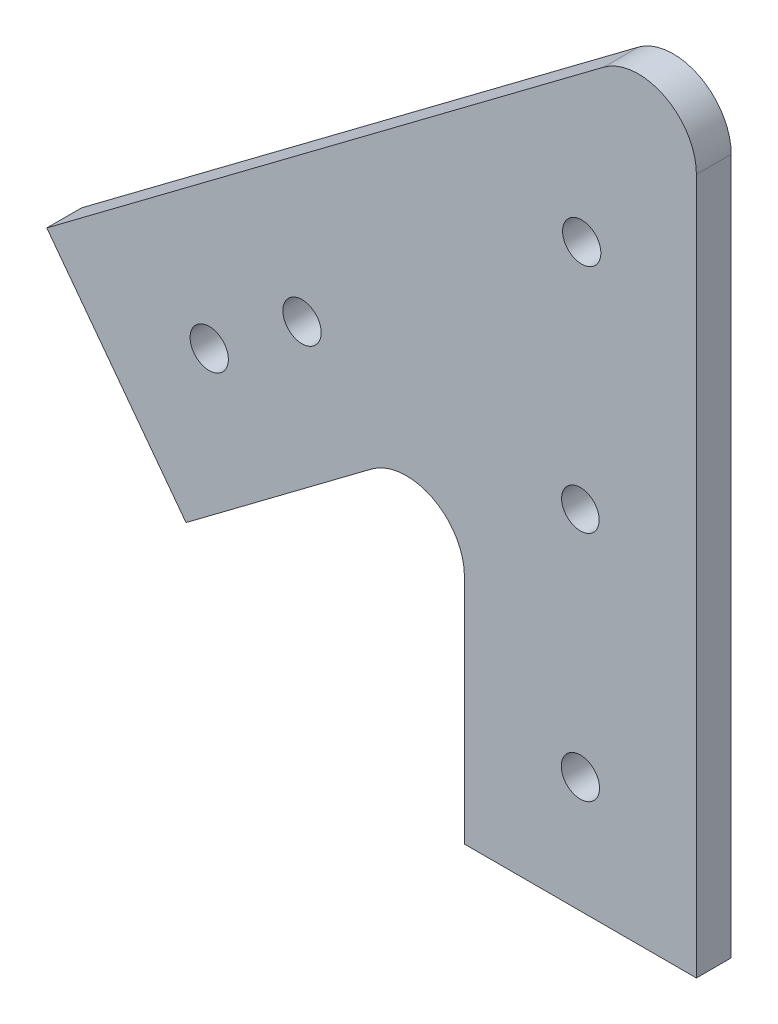
ISO-10303-21;
HEADER;
FILE_DESCRIPTION(('STEP AP214'),'2;1');
FILE_NAME('part.step','',(''),(''),'','','');
FILE_SCHEMA(('AUTOMOTIVE_DESIGN { 1 0 10303 214 1 1 1 1 }'));
ENDSEC;
DATA;
#1=APPLICATION_CONTEXT('core data for automotive mechanical design processes');
#2=APPLICATION_PROTOCOL_DEFINITION('international standard','automotive_design',2000,#1);
#3=PRODUCT_CONTEXT('',#1,'mechanical');
#4=PRODUCT('Part','Part','',(#3));
#5=PRODUCT_RELATED_PRODUCT_CATEGORY('part','',(#4));
#6=PRODUCT_DEFINITION_FORMATION('','',#4);
#7=PRODUCT_DEFINITION_CONTEXT('part definition',#1,'design');
#8=PRODUCT_DEFINITION('design','',#6,#7);
#9=PRODUCT_DEFINITION_SHAPE('','',#8);
#10=(LENGTH_UNIT() NAMED_UNIT(*) SI_UNIT(.MILLI.,.METRE.));
#11=(NAMED_UNIT(*) PLANE_ANGLE_UNIT() SI_UNIT($,.RADIAN.));
#12=(NAMED_UNIT(*) SI_UNIT($,.STERADIAN.) SOLID_ANGLE_UNIT());
#13=UNCERTAINTY_MEASURE_WITH_UNIT(LENGTH_MEASURE(1.E-05),#10,'distance_accuracy_value','');
#14=(GEOMETRIC_REPRESENTATION_CONTEXT(3) GLOBAL_UNCERTAINTY_ASSIGNED_CONTEXT((#13)) GLOBAL_UNIT_ASSIGNED_CONTEXT((#10,
#11,#12)) REPRESENTATION_CONTEXT('',''));
#15=CARTESIAN_POINT('',(0.,0.,0.));
#16=DIRECTION('',(0.,0.,1.));
#17=DIRECTION('',(1.,0.,0.));
#18=AXIS2_PLACEMENT_3D('',#15,#16,#17);
#19=CARTESIAN_POINT('',(-6.68660671893292,8.91547372518952,3.));
#20=DIRECTION('',(-0.60000008183758,0.799999938621808,0.));
#21=DIRECTION('',(-0.799999938621809,-0.60000008183758,0.));
#22=AXIS2_PLACEMENT_3D('',#19,#20,#21);
#23=PLANE('',#22);
#24=DIRECTION('',(0.799999938621809,0.60000008183758,0.));
#25=VECTOR('',#24,1.);
#26=CARTESIAN_POINT('',(-6.68660671893292,8.91547372518952,3.));
#27=LINE('',#26,#25);
#28=CARTESIAN_POINT('',(-28.3858603790068,-7.35896998825369,3.));
#29=VERTEX_POINT('',#28);
#30=CARTESIAN_POINT('',(19.611272302062,28.6388871943635,3.));
#31=VERTEX_POINT('',#30);
#32=EDGE_CURVE('E111',#29,#31,#27,.T.);
#33=ORIENTED_EDGE('',*,*,#32,.T.);
#34=DIRECTION('',(0.,0.,-1.));
#35=VECTOR('',#34,1.);
#36=CARTESIAN_POINT('',(19.611272302062,28.6388871943635,0.));
#37=LINE('',#36,#35);
#38=CARTESIAN_POINT('',(19.611272302062,28.6388871943635,0.));
#39=VERTEX_POINT('',#38);
#40=EDGE_CURVE('E118',#31,#39,#37,.T.);
#41=ORIENTED_EDGE('',*,*,#40,.T.);
#42=DIRECTION('',(0.799999938621809,0.60000008183758,0.));
#43=VECTOR('',#42,1.);
#44=CARTESIAN_POINT('',(-6.68660671893292,8.91547372518952,0.));
#45=LINE('',#44,#43);
#46=CARTESIAN_POINT('',(-28.3858603790068,-7.35896998825369,0.));
#47=VERTEX_POINT('',#46);
#48=EDGE_CURVE('E114',#47,#39,#45,.T.);
#49=ORIENTED_EDGE('',*,*,#48,.F.);
#50=DIRECTION('',(0.,0.,-1.));
#51=VECTOR('',#50,1.);
#52=CARTESIAN_POINT('',(-28.3858603790068,-7.35896998825369,3.));
#53=LINE('',#52,#51);
#54=EDGE_CURVE('E107',#29,#47,#53,.T.);
#55=ORIENTED_EDGE('',*,*,#54,.F.);
#56=EDGE_LOOP('',(#33,#41,#49,#55));
#57=FACE_BOUND('',#56,.T.);
#58=ADVANCED_FACE('F43',(#57),#23,.T.);
#59=CARTESIAN_POINT('',(-21.6992536600739,-16.2744437134432,3.));
#60=DIRECTION('',(0.799999938621811,0.600000081837577,0.));
#61=DIRECTION('',(-0.600000081837577,0.799999938621811,0.));
#62=AXIS2_PLACEMENT_3D('',#59,#60,#61);
#63=PLANE('',#62);
#64=DIRECTION('',(0.600000081837577,-0.799999938621811,0.));
#65=VECTOR('',#64,1.);
#66=CARTESIAN_POINT('',(-21.6992536600739,-16.2744437134432,0.));
#67=LINE('',#66,#65);
#68=CARTESIAN_POINT('',(-16.3858587422554,-23.3589687606897,0.));
#69=VERTEX_POINT('',#68);
#70=EDGE_CURVE('E164',#47,#69,#67,.T.);
#71=ORIENTED_EDGE('',*,*,#70,.T.);
#72=DIRECTION('',(0.,0.,-1.));
#73=VECTOR('',#72,1.);
#74=CARTESIAN_POINT('',(-16.3858587422554,-23.3589687606897,3.));
#75=LINE('',#74,#73);
#76=CARTESIAN_POINT('',(-16.3858587422554,-23.3589687606897,3.));
#77=VERTEX_POINT('',#76);
#78=EDGE_CURVE('E119',#77,#69,#75,.T.);
#79=ORIENTED_EDGE('',*,*,#78,.F.);
#80=DIRECTION('',(0.600000081837577,-0.799999938621811,0.));
#81=VECTOR('',#80,1.);
#82=CARTESIAN_POINT('',(-21.6992536600739,-16.2744437134432,3.));
#83=LINE('',#82,#81);
#84=EDGE_CURVE('E123',#29,#77,#83,.T.);
#85=ORIENTED_EDGE('',*,*,#84,.F.);
#86=ORIENTED_EDGE('',*,*,#54,.T.);
#87=EDGE_LOOP('',(#71,#79,#85,#86));
#88=FACE_BOUND('',#87,.T.);
#89=ADVANCED_FACE('F124',(#88),#63,.F.);
#90=CARTESIAN_POINT('',(5.31339491781853,-7.08452504724652,3.));
#91=DIRECTION('',(-0.600000081837576,0.799999938621811,0.));
#92=DIRECTION('',(-0.799999938621812,-0.600000081837576,0.));
#93=AXIS2_PLACEMENT_3D('',#90,#91,#92);
#94=PLANE('',#93);
#95=DIRECTION('',(0.799999938621812,0.600000081837576,0.));
#96=VECTOR('',#95,1.);
#97=CARTESIAN_POINT('',(5.31339491781853,-7.08452504724652,0.));
#98=LINE('',#97,#96);
#99=CARTESIAN_POINT('',(-0.386944549546448,-11.359780558907,0.));
#100=VERTEX_POINT('',#99);
#101=EDGE_CURVE('E166',#69,#100,#98,.T.);
#102=ORIENTED_EDGE('',*,*,#101,.T.);
#103=DIRECTION('',(0.,0.,-1.));
#104=VECTOR('',#103,1.);
#105=CARTESIAN_POINT('',(-0.386944549546447,-11.359780558907,3.));
#106=LINE('',#105,#104);
#107=CARTESIAN_POINT('',(-0.386944549546448,-11.359780558907,3.));
#108=VERTEX_POINT('',#107);
#109=EDGE_CURVE('E64',#100,#108,#106,.F.);
#110=ORIENTED_EDGE('',*,*,#109,.T.);
#111=DIRECTION('',(0.799999938621812,0.600000081837576,0.));
#112=VECTOR('',#111,1.);
#113=CARTESIAN_POINT('',(5.31339491781853,-7.08452504724652,3.));
#114=LINE('',#113,#112);
#115=EDGE_CURVE('E126',#77,#108,#114,.T.);
#116=ORIENTED_EDGE('',*,*,#115,.F.);
#117=ORIENTED_EDGE('',*,*,#78,.T.);
#118=EDGE_LOOP('',(#102,#110,#116,#117));
#119=FACE_BOUND('',#118,.T.);
#120=ADVANCED_FACE('F198',(#119),#94,.F.);
#121=CARTESIAN_POINT('',(7.61471993844445,-0.000825008627086125,3.));
#122=DIRECTION('',(0.999999994130797,-0.000108343921892486,0.));
#123=DIRECTION('',(0.000108343921892486,0.999999994130797,0.));
#124=AXIS2_PLACEMENT_3D('',#121,#122,#123);
#125=PLANE('',#124);
#126=DIRECTION('',(-0.000108343921892486,-0.999999994130797,0.));
#127=VECTOR('',#126,1.);
#128=CARTESIAN_POINT('',(7.61471993844445,-0.000825008627086125,3.));
#129=LINE('',#128,#127);
#130=CARTESIAN_POINT('',(7.61305583029542,-15.3603219716255,3.));
#131=VERTEX_POINT('',#130);
#132=CARTESIAN_POINT('',(7.6108891709763,-35.3582994174868,3.));
#133=VERTEX_POINT('',#132);
#134=EDGE_CURVE('E140',#131,#133,#129,.T.);
#135=ORIENTED_EDGE('',*,*,#134,.F.);
#136=DIRECTION('',(0.,0.,-1.));
#137=VECTOR('',#136,1.);
#138=CARTESIAN_POINT('',(7.61305583029542,-15.3603219716255,0.));
#139=LINE('',#138,#137);
#140=CARTESIAN_POINT('',(7.61305583029542,-15.3603219716255,0.));
#141=VERTEX_POINT('',#140);
#142=EDGE_CURVE('E189',#131,#141,#139,.T.);
#143=ORIENTED_EDGE('',*,*,#142,.T.);
#144=DIRECTION('',(-0.000108343921892486,-0.999999994130797,0.));
#145=VECTOR('',#144,1.);
#146=CARTESIAN_POINT('',(7.61471993844445,-0.000825008627086125,0.));
#147=LINE('',#146,#145);
#148=CARTESIAN_POINT('',(7.6108891709763,-35.3582994174868,0.));
#149=VERTEX_POINT('',#148);
#150=EDGE_CURVE('E168',#141,#149,#147,.T.);
#151=ORIENTED_EDGE('',*,*,#150,.T.);
#152=DIRECTION('',(0.,0.,-1.));
#153=VECTOR('',#152,1.);
#154=CARTESIAN_POINT('',(7.6108891709763,-35.3582994174868,3.));
#155=LINE('',#154,#153);
#156=EDGE_CURVE('E179',#133,#149,#155,.T.);
#157=ORIENTED_EDGE('',*,*,#156,.F.);
#158=EDGE_LOOP('',(#135,#143,#151,#157));
#159=FACE_BOUND('',#158,.T.);
#160=ADVANCED_FACE('F200',(#159),#125,.F.);
#161=CARTESIAN_POINT('',(0.,-35.3582994174867,3.));
#162=DIRECTION('',(0.,1.,0.));
#163=DIRECTION('',(0.,0.,1.));
#164=AXIS2_PLACEMENT_3D('',#161,#162,#163);
#165=PLANE('',#164);
#166=DIRECTION('',(1.,0.,0.));
#167=VECTOR('',#166,1.);
#168=CARTESIAN_POINT('',(0.,-35.3582994174867,0.));
#169=LINE('',#168,#167);
#170=CARTESIAN_POINT('',(27.6108890921853,-35.3582994174867,0.));
#171=VERTEX_POINT('',#170);
#172=EDGE_CURVE('E170',#149,#171,#169,.T.);
#173=ORIENTED_EDGE('',*,*,#172,.T.);
#174=DIRECTION('',(0.,0.,-1.));
#175=VECTOR('',#174,1.);
#176=CARTESIAN_POINT('',(27.6108890921853,-35.3582994174867,3.));
#177=LINE('',#176,#175);
#178=CARTESIAN_POINT('',(27.6108890921853,-35.3582994174867,3.));
#179=VERTEX_POINT('',#178);
#180=EDGE_CURVE('E147',#179,#171,#177,.T.);
#181=ORIENTED_EDGE('',*,*,#180,.F.);
#182=DIRECTION('',(1.,0.,0.));
#183=VECTOR('',#182,1.);
#184=CARTESIAN_POINT('',(0.,-35.3582994174867,3.));
#185=LINE('',#184,#183);
#186=EDGE_CURVE('E142',#133,#179,#185,.T.);
#187=ORIENTED_EDGE('',*,*,#186,.F.);
#188=ORIENTED_EDGE('',*,*,#156,.T.);
#189=EDGE_LOOP('',(#173,#181,#187,#188));
#190=FACE_BOUND('',#189,.T.);
#191=ADVANCED_FACE('F205',(#190),#165,.F.);
#192=CARTESIAN_POINT('',(-14.3858601744131,-9.35896855609586,3.));
#193=DIRECTION('',(0.,0.,-1.));
#194=DIRECTION('',(-1.,0.,0.));
#195=AXIS2_PLACEMENT_3D('',#192,#193,#194);
#196=CYLINDRICAL_SURFACE('',#195,1.64999999999982);
#197=CARTESIAN_POINT('',(-14.3858601744131,-9.35896855609586,3.));
#198=DIRECTION('',(0.,0.,1.));
#199=DIRECTION('',(1.,0.,0.));
#200=AXIS2_PLACEMENT_3D('',#197,#198,#199);
#201=CIRCLE('',#200,1.64999999999982);
#202=CARTESIAN_POINT('',(-12.7358601744133,-9.35896855609586,3.));
#203=VERTEX_POINT('',#202);
#204=EDGE_CURVE('E132',#203,#203,#201,.T.);
#205=ORIENTED_EDGE('',*,*,#204,.T.);
#206=EDGE_LOOP('',(#205));
#207=FACE_BOUND('',#206,.T.);
#208=CARTESIAN_POINT('',(-14.3858601744131,-9.35896855609586,0.));
#209=DIRECTION('',(0.,0.,1.));
#210=DIRECTION('',(1.,0.,0.));
#211=AXIS2_PLACEMENT_3D('',#208,#209,#210);
#212=CIRCLE('',#211,1.64999999999982);
#213=CARTESIAN_POINT('',(-12.7358601744133,-9.35896855609586,0.));
#214=VERTEX_POINT('',#213);
#215=EDGE_CURVE('E160',#214,#214,#212,.T.);
#216=ORIENTED_EDGE('',*,*,#215,.F.);
#217=EDGE_LOOP('',(#216));
#218=FACE_BOUND('',#217,.T.);
#219=ADVANCED_FACE('F229',(#207,#218),#196,.F.);
#220=CARTESIAN_POINT('',(-6.38586078819503,-3.3589677377201,3.));
#221=DIRECTION('',(0.,0.,-1.));
#222=DIRECTION('',(-1.,0.,0.));
#223=AXIS2_PLACEMENT_3D('',#220,#221,#222);
#224=CYLINDRICAL_SURFACE('',#223,1.64999999999982);
#225=CARTESIAN_POINT('',(-6.38586078819503,-3.3589677377201,3.));
#226=DIRECTION('',(0.,0.,1.));
#227=DIRECTION('',(1.,0.,0.));
#228=AXIS2_PLACEMENT_3D('',#225,#226,#227);
#229=CIRCLE('',#228,1.64999999999982);
#230=CARTESIAN_POINT('',(-4.73586078819521,-3.3589677377201,3.));
#231=VERTEX_POINT('',#230);
#232=EDGE_CURVE('E135',#231,#231,#229,.T.);
#233=ORIENTED_EDGE('',*,*,#232,.T.);
#234=EDGE_LOOP('',(#233));
#235=FACE_BOUND('',#234,.T.);
#236=CARTESIAN_POINT('',(-6.38586078819503,-3.3589677377201,0.));
#237=DIRECTION('',(0.,0.,1.));
#238=DIRECTION('',(1.,0.,0.));
#239=AXIS2_PLACEMENT_3D('',#236,#237,#238);
#240=CIRCLE('',#239,1.64999999999982);
#241=CARTESIAN_POINT('',(-4.73586078819521,-3.3589677377201,0.));
#242=VERTEX_POINT('',#241);
#243=EDGE_CURVE('E157',#242,#242,#240,.T.);
#244=ORIENTED_EDGE('',*,*,#243,.F.);
#245=EDGE_LOOP('',(#244));
#246=FACE_BOUND('',#245,.T.);
#247=ADVANCED_FACE('F232',(#235,#246),#224,.F.);
#248=CARTESIAN_POINT('',(17.6109530315067,-25.3582994174867,3.));
#249=DIRECTION('',(0.,0.,-1.));
#250=DIRECTION('',(-1.,0.,0.));
#251=AXIS2_PLACEMENT_3D('',#248,#249,#250);
#252=CYLINDRICAL_SURFACE('',#251,1.64999999999959);
#253=CARTESIAN_POINT('',(17.6109530315067,-25.3582994174867,3.));
#254=DIRECTION('',(0.,0.,1.));
#255=DIRECTION('',(1.,0.,0.));
#256=AXIS2_PLACEMENT_3D('',#253,#254,#255);
#257=CIRCLE('',#256,1.64999999999959);
#258=CARTESIAN_POINT('',(19.2609530315063,-25.3582994174867,3.));
#259=VERTEX_POINT('',#258);
#260=EDGE_CURVE('E270',#259,#259,#257,.T.);
#261=ORIENTED_EDGE('',*,*,#260,.T.);
#262=EDGE_LOOP('',(#261));
#263=FACE_BOUND('',#262,.T.);
#264=CARTESIAN_POINT('',(17.6109530315067,-25.3582994174867,0.));
#265=DIRECTION('',(0.,0.,1.));
#266=DIRECTION('',(1.,0.,0.));
#267=AXIS2_PLACEMENT_3D('',#264,#265,#266);
#268=CIRCLE('',#267,1.64999999999959);
#269=CARTESIAN_POINT('',(19.2609530315063,-25.3582994174867,0.));
#270=VERTEX_POINT('',#269);
#271=EDGE_CURVE('E154',#270,#270,#268,.T.);
#272=ORIENTED_EDGE('',*,*,#271,.F.);
#273=EDGE_LOOP('',(#272));
#274=FACE_BOUND('',#273,.T.);
#275=ADVANCED_FACE('F236',(#263,#274),#252,.F.);
#276=CARTESIAN_POINT('',(17.6109530315061,-5.35829941748672,3.));
#277=DIRECTION('',(0.,0.,-1.));
#278=DIRECTION('',(-1.,0.,0.));
#279=AXIS2_PLACEMENT_3D('',#276,#277,#278);
#280=CYLINDRICAL_SURFACE('',#279,1.62029537425608);
#281=CARTESIAN_POINT('',(17.6109530315061,-5.35829941748672,3.));
#282=DIRECTION('',(0.,0.,1.));
#283=DIRECTION('',(1.,0.,0.));
#284=AXIS2_PLACEMENT_3D('',#281,#282,#283);
#285=CIRCLE('',#284,1.62029537425608);
#286=CARTESIAN_POINT('',(19.2312484057621,-5.35829941748672,3.));
#287=VERTEX_POINT('',#286);
#288=EDGE_CURVE('E267',#287,#287,#285,.T.);
#289=ORIENTED_EDGE('',*,*,#288,.T.);
#290=EDGE_LOOP('',(#289));
#291=FACE_BOUND('',#290,.T.);
#292=CARTESIAN_POINT('',(17.6109530315061,-5.35829941748672,0.));
#293=DIRECTION('',(0.,0.,1.));
#294=DIRECTION('',(1.,0.,0.));
#295=AXIS2_PLACEMENT_3D('',#292,#293,#294);
#296=CIRCLE('',#295,1.62029537425608);
#297=CARTESIAN_POINT('',(19.2312484057621,-5.35829941748672,0.));
#298=VERTEX_POINT('',#297);
#299=EDGE_CURVE('E151',#298,#298,#296,.T.);
#300=ORIENTED_EDGE('',*,*,#299,.F.);
#301=EDGE_LOOP('',(#300));
#302=FACE_BOUND('',#301,.T.);
#303=ADVANCED_FACE('F240',(#291,#302),#280,.F.);
#304=CARTESIAN_POINT('',(17.7247881129585,14.6417005825133,3.));
#305=DIRECTION('',(0.,0.,-1.));
#306=DIRECTION('',(-1.,0.,0.));
#307=AXIS2_PLACEMENT_3D('',#304,#305,#306);
#308=CYLINDRICAL_SURFACE('',#307,1.6499999999998);
#309=CARTESIAN_POINT('',(17.7247881129585,14.6417005825133,3.));
#310=DIRECTION('',(0.,0.,1.));
#311=DIRECTION('',(1.,0.,0.));
#312=AXIS2_PLACEMENT_3D('',#309,#310,#311);
#313=CIRCLE('',#312,1.6499999999998);
#314=CARTESIAN_POINT('',(19.3747881129583,14.6417005825133,3.));
#315=VERTEX_POINT('',#314);
#316=EDGE_CURVE('E176',#315,#315,#313,.T.);
#317=ORIENTED_EDGE('',*,*,#316,.T.);
#318=EDGE_LOOP('',(#317));
#319=FACE_BOUND('',#318,.T.);
#320=CARTESIAN_POINT('',(17.7247881129585,14.6417005825133,0.));
#321=DIRECTION('',(0.,0.,1.));
#322=DIRECTION('',(1.,0.,0.));
#323=AXIS2_PLACEMENT_3D('',#320,#321,#322);
#324=CIRCLE('',#323,1.6499999999998);
#325=CARTESIAN_POINT('',(19.3747881129583,14.6417005825133,0.));
#326=VERTEX_POINT('',#325);
#327=EDGE_CURVE('E148',#326,#326,#324,.T.);
#328=ORIENTED_EDGE('',*,*,#327,.F.);
#329=EDGE_LOOP('',(#328));
#330=FACE_BOUND('',#329,.T.);
#331=ADVANCED_FACE('F243',(#319,#330),#308,.F.);
#332=CARTESIAN_POINT('',(27.6111151703456,-0.00017654416048793,3.));
#333=DIRECTION('',(-0.999999999979559,6.39395255842221E-06,0.));
#334=DIRECTION('',(-6.39395255842221E-06,-0.999999999979559,0.));
#335=AXIS2_PLACEMENT_3D('',#332,#333,#334);
#336=PLANE('',#335);
#337=DIRECTION('',(6.39395255842221E-06,0.999999999979559,0.));
#338=VECTOR('',#337,1.);
#339=CARTESIAN_POINT('',(27.6111151703456,-0.00017654416048793,0.));
#340=LINE('',#339,#338);
#341=CARTESIAN_POINT('',(27.6112727111477,24.6388555314917,0.));
#342=VERTEX_POINT('',#341);
#343=EDGE_CURVE('E173',#171,#342,#340,.T.);
#344=ORIENTED_EDGE('',*,*,#343,.T.);
#345=DIRECTION('',(0.,0.,-1.));
#346=VECTOR('',#345,1.);
#347=CARTESIAN_POINT('',(27.6112727111477,24.6388555314917,3.));
#348=LINE('',#347,#346);
#349=CARTESIAN_POINT('',(27.6112727111477,24.6388555314917,3.));
#350=VERTEX_POINT('',#349);
#351=EDGE_CURVE('E186',#342,#350,#348,.F.);
#352=ORIENTED_EDGE('',*,*,#351,.T.);
#353=DIRECTION('',(6.39395255842221E-06,0.999999999979559,0.));
#354=VECTOR('',#353,1.);
#355=CARTESIAN_POINT('',(27.6111151703456,-0.00017654416048793,3.));
#356=LINE('',#355,#354);
#357=EDGE_CURVE('E145',#179,#350,#356,.T.);
#358=ORIENTED_EDGE('',*,*,#357,.F.);
#359=ORIENTED_EDGE('',*,*,#180,.T.);
#360=EDGE_LOOP('',(#344,#352,#358,#359));
#361=FACE_BOUND('',#360,.T.);
#362=ADVANCED_FACE('F207',(#361),#336,.F.);
#363=CARTESIAN_POINT('',(0.,0.,3.));
#364=DIRECTION('',(0.,0.,1.));
#365=DIRECTION('',(1.,0.,0.));
#366=AXIS2_PLACEMENT_3D('',#363,#364,#365);
#367=PLANE('',#366);
#368=ORIENTED_EDGE('',*,*,#316,.F.);
#369=EDGE_LOOP('',(#368));
#370=FACE_BOUND('',#369,.T.);
#371=ORIENTED_EDGE('',*,*,#288,.F.);
#372=EDGE_LOOP('',(#371));
#373=FACE_BOUND('',#372,.T.);
#374=ORIENTED_EDGE('',*,*,#260,.F.);
#375=EDGE_LOOP('',(#374));
#376=FACE_BOUND('',#375,.T.);
#377=ORIENTED_EDGE('',*,*,#232,.F.);
#378=EDGE_LOOP('',(#377));
#379=FACE_BOUND('',#378,.T.);
#380=ORIENTED_EDGE('',*,*,#204,.F.);
#381=EDGE_LOOP('',(#380));
#382=FACE_BOUND('',#381,.T.);
#383=ORIENTED_EDGE('',*,*,#357,.T.);
#384=CARTESIAN_POINT('',(22.6112727112499,24.6388875012545,3.));
#385=DIRECTION('',(0.,0.,1.));
#386=DIRECTION('',(1.,0.,0.));
#387=AXIS2_PLACEMENT_3D('',#384,#385,#386);
#388=CIRCLE('',#387,5.);
#389=EDGE_CURVE('E131',#350,#31,#388,.T.);
#390=ORIENTED_EDGE('',*,*,#389,.T.);
#391=ORIENTED_EDGE('',*,*,#32,.F.);
#392=ORIENTED_EDGE('',*,*,#84,.T.);
#393=ORIENTED_EDGE('',*,*,#115,.T.);
#394=CARTESIAN_POINT('',(2.61305585964143,-15.3597802520161,3.));
#395=DIRECTION('',(0.,0.,1.));
#396=DIRECTION('',(1.,0.,0.));
#397=AXIS2_PLACEMENT_3D('',#394,#395,#396);
#398=CIRCLE('',#397,5.);
#399=EDGE_CURVE('E11',#108,#131,#398,.F.);
#400=ORIENTED_EDGE('',*,*,#399,.T.);
#401=ORIENTED_EDGE('',*,*,#134,.T.);
#402=ORIENTED_EDGE('',*,*,#186,.T.);
#403=EDGE_LOOP('',(#383,#390,#391,#392,#393,#400,#401,#402));
#404=FACE_BOUND('',#403,.T.);
#405=ADVANCED_FACE('F129',(#370,#373,#376,#379,#382,#404),#367,.T.);
#406=CARTESIAN_POINT('',(0.,0.,0.));
#407=DIRECTION('',(0.,0.,1.));
#408=DIRECTION('',(1.,0.,0.));
#409=AXIS2_PLACEMENT_3D('',#406,#407,#408);
#410=PLANE('',#409);
#411=ORIENTED_EDGE('',*,*,#327,.T.);
#412=EDGE_LOOP('',(#411));
#413=FACE_BOUND('',#412,.T.);
#414=ORIENTED_EDGE('',*,*,#299,.T.);
#415=EDGE_LOOP('',(#414));
#416=FACE_BOUND('',#415,.T.);
#417=ORIENTED_EDGE('',*,*,#271,.T.);
#418=EDGE_LOOP('',(#417));
#419=FACE_BOUND('',#418,.T.);
#420=ORIENTED_EDGE('',*,*,#243,.T.);
#421=EDGE_LOOP('',(#420));
#422=FACE_BOUND('',#421,.T.);
#423=ORIENTED_EDGE('',*,*,#215,.T.);
#424=EDGE_LOOP('',(#423));
#425=FACE_BOUND('',#424,.T.);
#426=ORIENTED_EDGE('',*,*,#48,.T.);
#427=CARTESIAN_POINT('',(22.6112727112499,24.6388875012545,0.));
#428=DIRECTION('',(0.,0.,1.));
#429=DIRECTION('',(1.,0.,0.));
#430=AXIS2_PLACEMENT_3D('',#427,#428,#429);
#431=CIRCLE('',#430,5.);
#432=EDGE_CURVE('E184',#39,#342,#431,.F.);
#433=ORIENTED_EDGE('',*,*,#432,.T.);
#434=ORIENTED_EDGE('',*,*,#343,.F.);
#435=ORIENTED_EDGE('',*,*,#172,.F.);
#436=ORIENTED_EDGE('',*,*,#150,.F.);
#437=CARTESIAN_POINT('',(2.61305585964143,-15.3597802520161,0.));
#438=DIRECTION('',(0.,0.,1.));
#439=DIRECTION('',(1.,0.,0.));
#440=AXIS2_PLACEMENT_3D('',#437,#438,#439);
#441=CIRCLE('',#440,5.);
#442=EDGE_CURVE('E51',#141,#100,#441,.T.);
#443=ORIENTED_EDGE('',*,*,#442,.T.);
#444=ORIENTED_EDGE('',*,*,#101,.F.);
#445=ORIENTED_EDGE('',*,*,#70,.F.);
#446=EDGE_LOOP('',(#426,#433,#434,#435,#436,#443,#444,#445));
#447=FACE_BOUND('',#446,.T.);
#448=ADVANCED_FACE('F194',(#413,#416,#419,#422,#425,#447),#410,.F.);
#449=CARTESIAN_POINT('',(22.6112727112499,24.6388875012545,3.));
#450=DIRECTION('',(0.,0.,1.));
#451=DIRECTION('',(1.,0.,0.));
#452=AXIS2_PLACEMENT_3D('',#449,#450,#451);
#453=CYLINDRICAL_SURFACE('',#452,5.);
#454=ORIENTED_EDGE('',*,*,#389,.F.);
#455=ORIENTED_EDGE('',*,*,#351,.F.);
#456=ORIENTED_EDGE('',*,*,#432,.F.);
#457=ORIENTED_EDGE('',*,*,#40,.F.);
#458=EDGE_LOOP('',(#454,#455,#456,#457));
#459=FACE_BOUND('',#458,.T.);
#460=ADVANCED_FACE('F210',(#459),#453,.T.);
#461=CARTESIAN_POINT('',(2.61305585964143,-15.3597802520161,3.));
#462=DIRECTION('',(0.,0.,1.));
#463=DIRECTION('',(1.,0.,0.));
#464=AXIS2_PLACEMENT_3D('',#461,#462,#463);
#465=CYLINDRICAL_SURFACE('',#464,5.);
#466=ORIENTED_EDGE('',*,*,#399,.F.);
#467=ORIENTED_EDGE('',*,*,#109,.F.);
#468=ORIENTED_EDGE('',*,*,#442,.F.);
#469=ORIENTED_EDGE('',*,*,#142,.F.);
#470=EDGE_LOOP('',(#466,#467,#468,#469));
#471=FACE_BOUND('',#470,.T.);
#472=ADVANCED_FACE('F45',(#471),#465,.F.);
#473=CLOSED_SHELL('',(#58,#89,#120,#160,#191,#219,#247,#275,#303,#331,#362,#405,#448,#460,#472));
#474=MANIFOLD_SOLID_BREP('B2',#473);
#475=ADVANCED_BREP_SHAPE_REPRESENTATION('',(#18,#474),#14);
#476=SHAPE_DEFINITION_REPRESENTATION(#9,#475);
ENDSEC;
END-ISO-10303-21;
